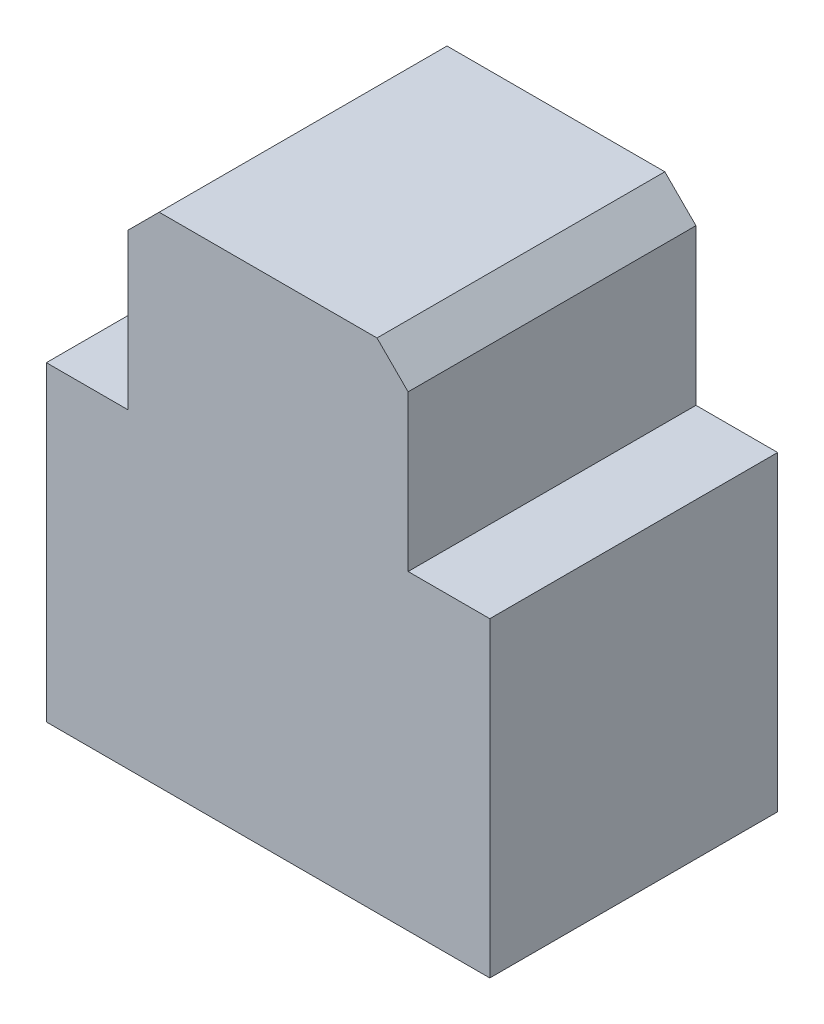
ISO-10303-21;
HEADER;
FILE_DESCRIPTION(('STEP AP214'),'2;1');
FILE_NAME('part.step','',(''),(''),'','','');
FILE_SCHEMA(('AUTOMOTIVE_DESIGN { 1 0 10303 214 1 1 1 1 }'));
ENDSEC;
DATA;
#1=APPLICATION_CONTEXT('core data for automotive mechanical design processes');
#2=APPLICATION_PROTOCOL_DEFINITION('international standard','automotive_design',2000,#1);
#3=PRODUCT_CONTEXT('',#1,'mechanical');
#4=PRODUCT('Part','Part','',(#3));
#5=PRODUCT_RELATED_PRODUCT_CATEGORY('part','',(#4));
#6=PRODUCT_DEFINITION_FORMATION('','',#4);
#7=PRODUCT_DEFINITION_CONTEXT('part definition',#1,'design');
#8=PRODUCT_DEFINITION('design','',#6,#7);
#9=PRODUCT_DEFINITION_SHAPE('','',#8);
#10=(LENGTH_UNIT() NAMED_UNIT(*) SI_UNIT(.MILLI.,.METRE.));
#11=(NAMED_UNIT(*) PLANE_ANGLE_UNIT() SI_UNIT($,.RADIAN.));
#12=(NAMED_UNIT(*) SI_UNIT($,.STERADIAN.) SOLID_ANGLE_UNIT());
#13=UNCERTAINTY_MEASURE_WITH_UNIT(LENGTH_MEASURE(1.E-05),#10,'distance_accuracy_value','');
#14=(GEOMETRIC_REPRESENTATION_CONTEXT(3) GLOBAL_UNCERTAINTY_ASSIGNED_CONTEXT((#13)) GLOBAL_UNIT_ASSIGNED_CONTEXT((#10,
#11,#12)) REPRESENTATION_CONTEXT('',''));
#15=CARTESIAN_POINT('',(0.,0.,0.));
#16=DIRECTION('',(0.,0.,1.));
#17=DIRECTION('',(1.,0.,0.));
#18=AXIS2_PLACEMENT_3D('',#15,#16,#17);
#19=CARTESIAN_POINT('',(2.85,0.,3.7));
#20=DIRECTION('',(1.,0.,0.));
#21=DIRECTION('',(0.,1.,0.));
#22=AXIS2_PLACEMENT_3D('',#19,#20,#21);
#23=PLANE('',#22);
#24=DIRECTION('',(0.,-1.,0.));
#25=VECTOR('',#24,1.);
#26=CARTESIAN_POINT('',(2.85,0.,0.));
#27=LINE('',#26,#25);
#28=CARTESIAN_POINT('',(2.85,2.,0.));
#29=VERTEX_POINT('',#28);
#30=CARTESIAN_POINT('',(2.85,-2.,0.));
#31=VERTEX_POINT('',#30);
#32=EDGE_CURVE('E133',#29,#31,#27,.T.);
#33=ORIENTED_EDGE('',*,*,#32,.F.);
#34=DIRECTION('',(0.,0.,-1.));
#35=VECTOR('',#34,1.);
#36=CARTESIAN_POINT('',(2.85,2.,3.7));
#37=LINE('',#36,#35);
#38=CARTESIAN_POINT('',(2.85,2.,3.7));
#39=VERTEX_POINT('',#38);
#40=EDGE_CURVE('E129',#39,#29,#37,.T.);
#41=ORIENTED_EDGE('',*,*,#40,.F.);
#42=DIRECTION('',(0.,-1.,0.));
#43=VECTOR('',#42,1.);
#44=CARTESIAN_POINT('',(2.85,0.,3.7));
#45=LINE('',#44,#43);
#46=CARTESIAN_POINT('',(2.85,-2.,3.7));
#47=VERTEX_POINT('',#46);
#48=EDGE_CURVE('E131',#39,#47,#45,.T.);
#49=ORIENTED_EDGE('',*,*,#48,.T.);
#50=DIRECTION('',(0.,0.,-1.));
#51=VECTOR('',#50,1.);
#52=CARTESIAN_POINT('',(2.85,-2.,3.7));
#53=LINE('',#52,#51);
#54=EDGE_CURVE('E179',#47,#31,#53,.T.);
#55=ORIENTED_EDGE('',*,*,#54,.T.);
#56=EDGE_LOOP('',(#33,#41,#49,#55));
#57=FACE_BOUND('',#56,.T.);
#58=ADVANCED_FACE('F49',(#57),#23,.T.);
#59=CARTESIAN_POINT('',(0.,2.,3.7));
#60=DIRECTION('',(0.,1.,0.));
#61=DIRECTION('',(0.,0.,1.));
#62=AXIS2_PLACEMENT_3D('',#59,#60,#61);
#63=PLANE('',#62);
#64=DIRECTION('',(1.,0.,0.));
#65=VECTOR('',#64,1.);
#66=CARTESIAN_POINT('',(0.,2.,0.));
#67=LINE('',#66,#65);
#68=CARTESIAN_POINT('',(1.8,2.,0.));
#69=VERTEX_POINT('',#68);
#70=EDGE_CURVE('E182',#69,#29,#67,.T.);
#71=ORIENTED_EDGE('',*,*,#70,.F.);
#72=DIRECTION('',(0.,0.,-1.));
#73=VECTOR('',#72,1.);
#74=CARTESIAN_POINT('',(1.8,2.,3.7));
#75=LINE('',#74,#73);
#76=CARTESIAN_POINT('',(1.8,2.,3.7));
#77=VERTEX_POINT('',#76);
#78=EDGE_CURVE('E140',#77,#69,#75,.T.);
#79=ORIENTED_EDGE('',*,*,#78,.F.);
#80=DIRECTION('',(1.,0.,0.));
#81=VECTOR('',#80,1.);
#82=CARTESIAN_POINT('',(0.,2.,3.7));
#83=LINE('',#82,#81);
#84=EDGE_CURVE('E144',#77,#39,#83,.T.);
#85=ORIENTED_EDGE('',*,*,#84,.T.);
#86=ORIENTED_EDGE('',*,*,#40,.T.);
#87=EDGE_LOOP('',(#71,#79,#85,#86));
#88=FACE_BOUND('',#87,.T.);
#89=ADVANCED_FACE('F151',(#88),#63,.T.);
#90=CARTESIAN_POINT('',(1.8,0.,3.7));
#91=DIRECTION('',(-1.,0.,0.));
#92=DIRECTION('',(0.,-1.,0.));
#93=AXIS2_PLACEMENT_3D('',#90,#91,#92);
#94=PLANE('',#93);
#95=DIRECTION('',(0.,1.,0.));
#96=VECTOR('',#95,1.);
#97=CARTESIAN_POINT('',(1.8,0.,0.));
#98=LINE('',#97,#96);
#99=CARTESIAN_POINT('',(1.8,4.,0.));
#100=VERTEX_POINT('',#99);
#101=EDGE_CURVE('E185',#69,#100,#98,.T.);
#102=ORIENTED_EDGE('',*,*,#101,.T.);
#103=DIRECTION('',(0.,0.,1.));
#104=VECTOR('',#103,1.);
#105=CARTESIAN_POINT('',(1.8,4.,3.7));
#106=LINE('',#105,#104);
#107=CARTESIAN_POINT('',(1.8,4.,3.7));
#108=VERTEX_POINT('',#107);
#109=EDGE_CURVE('E11',#100,#108,#106,.T.);
#110=ORIENTED_EDGE('',*,*,#109,.T.);
#111=DIRECTION('',(0.,1.,0.));
#112=VECTOR('',#111,1.);
#113=CARTESIAN_POINT('',(1.8,0.,3.7));
#114=LINE('',#113,#112);
#115=EDGE_CURVE('E153',#77,#108,#114,.T.);
#116=ORIENTED_EDGE('',*,*,#115,.F.);
#117=ORIENTED_EDGE('',*,*,#78,.T.);
#118=EDGE_LOOP('',(#102,#110,#116,#117));
#119=FACE_BOUND('',#118,.T.);
#120=ADVANCED_FACE('F256',(#119),#94,.F.);
#121=CARTESIAN_POINT('',(0.,4.4,3.7));
#122=DIRECTION('',(0.,1.,0.));
#123=DIRECTION('',(0.,0.,1.));
#124=AXIS2_PLACEMENT_3D('',#121,#122,#123);
#125=PLANE('',#124);
#126=DIRECTION('',(1.,0.,0.));
#127=VECTOR('',#126,1.);
#128=CARTESIAN_POINT('',(0.,4.4,0.));
#129=LINE('',#128,#127);
#130=CARTESIAN_POINT('',(-1.4,4.4,0.));
#131=VERTEX_POINT('',#130);
#132=CARTESIAN_POINT('',(1.4,4.4,0.));
#133=VERTEX_POINT('',#132);
#134=EDGE_CURVE('E189',#131,#133,#129,.T.);
#135=ORIENTED_EDGE('',*,*,#134,.F.);
#136=DIRECTION('',(0.,0.,1.));
#137=VECTOR('',#136,1.);
#138=CARTESIAN_POINT('',(-1.4,4.4,3.7));
#139=LINE('',#138,#137);
#140=CARTESIAN_POINT('',(-1.4,4.4,3.7));
#141=VERTEX_POINT('',#140);
#142=EDGE_CURVE('E229',#131,#141,#139,.T.);
#143=ORIENTED_EDGE('',*,*,#142,.T.);
#144=DIRECTION('',(1.,0.,0.));
#145=VECTOR('',#144,1.);
#146=CARTESIAN_POINT('',(0.,4.4,3.7));
#147=LINE('',#146,#145);
#148=CARTESIAN_POINT('',(1.4,4.4,3.7));
#149=VERTEX_POINT('',#148);
#150=EDGE_CURVE('E157',#141,#149,#147,.T.);
#151=ORIENTED_EDGE('',*,*,#150,.T.);
#152=DIRECTION('',(0.,0.,-1.));
#153=VECTOR('',#152,1.);
#154=CARTESIAN_POINT('',(1.4,4.4,0.));
#155=LINE('',#154,#153);
#156=EDGE_CURVE('E225',#149,#133,#155,.T.);
#157=ORIENTED_EDGE('',*,*,#156,.T.);
#158=EDGE_LOOP('',(#135,#143,#151,#157));
#159=FACE_BOUND('',#158,.T.);
#160=ADVANCED_FACE('F260',(#159),#125,.T.);
#161=CARTESIAN_POINT('',(-1.8,0.,3.7));
#162=DIRECTION('',(-1.,0.,0.));
#163=DIRECTION('',(0.,-1.,0.));
#164=AXIS2_PLACEMENT_3D('',#161,#162,#163);
#165=PLANE('',#164);
#166=DIRECTION('',(0.,1.,0.));
#167=VECTOR('',#166,1.);
#168=CARTESIAN_POINT('',(-1.8,0.,3.7));
#169=LINE('',#168,#167);
#170=CARTESIAN_POINT('',(-1.8,2.,3.7));
#171=VERTEX_POINT('',#170);
#172=CARTESIAN_POINT('',(-1.8,4.,3.7));
#173=VERTEX_POINT('',#172);
#174=EDGE_CURVE('E162',#171,#173,#169,.T.);
#175=ORIENTED_EDGE('',*,*,#174,.T.);
#176=DIRECTION('',(0.,0.,-1.));
#177=VECTOR('',#176,1.);
#178=CARTESIAN_POINT('',(-1.8,4.,3.7));
#179=LINE('',#178,#177);
#180=CARTESIAN_POINT('',(-1.8,4.,0.));
#181=VERTEX_POINT('',#180);
#182=EDGE_CURVE('E139',#173,#181,#179,.T.);
#183=ORIENTED_EDGE('',*,*,#182,.T.);
#184=DIRECTION('',(0.,1.,0.));
#185=VECTOR('',#184,1.);
#186=CARTESIAN_POINT('',(-1.8,0.,0.));
#187=LINE('',#186,#185);
#188=CARTESIAN_POINT('',(-1.8,2.,0.));
#189=VERTEX_POINT('',#188);
#190=EDGE_CURVE('E193',#189,#181,#187,.T.);
#191=ORIENTED_EDGE('',*,*,#190,.F.);
#192=DIRECTION('',(0.,0.,-1.));
#193=VECTOR('',#192,1.);
#194=CARTESIAN_POINT('',(-1.8,2.,3.7));
#195=LINE('',#194,#193);
#196=EDGE_CURVE('E212',#171,#189,#195,.T.);
#197=ORIENTED_EDGE('',*,*,#196,.F.);
#198=EDGE_LOOP('',(#175,#183,#191,#197));
#199=FACE_BOUND('',#198,.T.);
#200=ADVANCED_FACE('F239',(#199),#165,.T.);
#201=CARTESIAN_POINT('',(-2.85,2.,0.));
#202=VERTEX_POINT('',#201);
#203=EDGE_CURVE('E186',#202,#189,#67,.T.);
#204=ORIENTED_EDGE('',*,*,#203,.F.);
#205=DIRECTION('',(0.,0.,-1.));
#206=VECTOR('',#205,1.);
#207=CARTESIAN_POINT('',(-2.85,2.,3.7));
#208=LINE('',#207,#206);
#209=CARTESIAN_POINT('',(-2.85,2.,3.7));
#210=VERTEX_POINT('',#209);
#211=EDGE_CURVE('E209',#210,#202,#208,.T.);
#212=ORIENTED_EDGE('',*,*,#211,.F.);
#213=EDGE_CURVE('E155',#210,#171,#83,.T.);
#214=ORIENTED_EDGE('',*,*,#213,.T.);
#215=ORIENTED_EDGE('',*,*,#196,.T.);
#216=EDGE_LOOP('',(#204,#212,#214,#215));
#217=FACE_BOUND('',#216,.T.);
#218=ADVANCED_FACE('F248',(#217),#63,.T.);
#219=CARTESIAN_POINT('',(-2.85,0.,3.7));
#220=DIRECTION('',(1.,0.,0.));
#221=DIRECTION('',(0.,1.,0.));
#222=AXIS2_PLACEMENT_3D('',#219,#220,#221);
#223=PLANE('',#222);
#224=DIRECTION('',(0.,-1.,0.));
#225=VECTOR('',#224,1.);
#226=CARTESIAN_POINT('',(-2.85,0.,0.));
#227=LINE('',#226,#225);
#228=CARTESIAN_POINT('',(-2.85,-2.,0.));
#229=VERTEX_POINT('',#228);
#230=EDGE_CURVE('E197',#202,#229,#227,.T.);
#231=ORIENTED_EDGE('',*,*,#230,.T.);
#232=DIRECTION('',(0.,0.,-1.));
#233=VECTOR('',#232,1.);
#234=CARTESIAN_POINT('',(-2.85,-2.,3.7));
#235=LINE('',#234,#233);
#236=CARTESIAN_POINT('',(-2.85,-2.,3.7));
#237=VERTEX_POINT('',#236);
#238=EDGE_CURVE('E205',#237,#229,#235,.T.);
#239=ORIENTED_EDGE('',*,*,#238,.F.);
#240=DIRECTION('',(0.,-1.,0.));
#241=VECTOR('',#240,1.);
#242=CARTESIAN_POINT('',(-2.85,0.,3.7));
#243=LINE('',#242,#241);
#244=EDGE_CURVE('E161',#210,#237,#243,.T.);
#245=ORIENTED_EDGE('',*,*,#244,.F.);
#246=ORIENTED_EDGE('',*,*,#211,.T.);
#247=EDGE_LOOP('',(#231,#239,#245,#246));
#248=FACE_BOUND('',#247,.T.);
#249=ADVANCED_FACE('F252',(#248),#223,.F.);
#250=CARTESIAN_POINT('',(0.,-2.,3.7));
#251=DIRECTION('',(0.,1.,0.));
#252=DIRECTION('',(0.,0.,1.));
#253=AXIS2_PLACEMENT_3D('',#250,#251,#252);
#254=PLANE('',#253);
#255=DIRECTION('',(1.,0.,0.));
#256=VECTOR('',#255,1.);
#257=CARTESIAN_POINT('',(0.,-2.,0.));
#258=LINE('',#257,#256);
#259=EDGE_CURVE('E149',#229,#31,#258,.T.);
#260=ORIENTED_EDGE('',*,*,#259,.T.);
#261=ORIENTED_EDGE('',*,*,#54,.F.);
#262=DIRECTION('',(1.,0.,0.));
#263=VECTOR('',#262,1.);
#264=CARTESIAN_POINT('',(0.,-2.,3.7));
#265=LINE('',#264,#263);
#266=EDGE_CURVE('E146',#237,#47,#265,.T.);
#267=ORIENTED_EDGE('',*,*,#266,.F.);
#268=ORIENTED_EDGE('',*,*,#238,.T.);
#269=EDGE_LOOP('',(#260,#261,#267,#268));
#270=FACE_BOUND('',#269,.T.);
#271=ADVANCED_FACE('F254',(#270),#254,.F.);
#272=CARTESIAN_POINT('',(0.,0.,3.7));
#273=DIRECTION('',(0.,0.,1.));
#274=DIRECTION('',(1.,0.,0.));
#275=AXIS2_PLACEMENT_3D('',#272,#273,#274);
#276=PLANE('',#275);
#277=ORIENTED_EDGE('',*,*,#150,.F.);
#278=DIRECTION('',(0.70710678118655,0.707106781186545,0.));
#279=VECTOR('',#278,1.);
#280=CARTESIAN_POINT('',(-2.89999999999999,2.90000000000001,3.7));
#281=LINE('',#280,#279);
#282=EDGE_CURVE('E59',#141,#173,#281,.F.);
#283=ORIENTED_EDGE('',*,*,#282,.T.);
#284=ORIENTED_EDGE('',*,*,#174,.F.);
#285=ORIENTED_EDGE('',*,*,#213,.F.);
#286=ORIENTED_EDGE('',*,*,#244,.T.);
#287=ORIENTED_EDGE('',*,*,#266,.T.);
#288=ORIENTED_EDGE('',*,*,#48,.F.);
#289=ORIENTED_EDGE('',*,*,#84,.F.);
#290=ORIENTED_EDGE('',*,*,#115,.T.);
#291=DIRECTION('',(-0.707106781186545,0.70710678118655,0.));
#292=VECTOR('',#291,1.);
#293=CARTESIAN_POINT('',(2.90000000000001,2.89999999999999,3.7));
#294=LINE('',#293,#292);
#295=EDGE_CURVE('E71',#108,#149,#294,.T.);
#296=ORIENTED_EDGE('',*,*,#295,.T.);
#297=EDGE_LOOP('',(#277,#283,#284,#285,#286,#287,#288,#289,#290,#296));
#298=FACE_BOUND('',#297,.T.);
#299=ADVANCED_FACE('F143',(#298),#276,.T.);
#300=CARTESIAN_POINT('',(0.,0.,0.));
#301=DIRECTION('',(0.,0.,1.));
#302=DIRECTION('',(1.,0.,0.));
#303=AXIS2_PLACEMENT_3D('',#300,#301,#302);
#304=PLANE('',#303);
#305=ORIENTED_EDGE('',*,*,#190,.T.);
#306=DIRECTION('',(-0.70710678118655,-0.707106781186545,0.));
#307=VECTOR('',#306,1.);
#308=CARTESIAN_POINT('',(-1.8,4.,0.));
#309=LINE('',#308,#307);
#310=EDGE_CURVE('E222',#181,#131,#309,.F.);
#311=ORIENTED_EDGE('',*,*,#310,.T.);
#312=ORIENTED_EDGE('',*,*,#134,.T.);
#313=DIRECTION('',(0.707106781186545,-0.70710678118655,0.));
#314=VECTOR('',#313,1.);
#315=CARTESIAN_POINT('',(1.4,4.4,0.));
#316=LINE('',#315,#314);
#317=EDGE_CURVE('E219',#133,#100,#316,.T.);
#318=ORIENTED_EDGE('',*,*,#317,.T.);
#319=ORIENTED_EDGE('',*,*,#101,.F.);
#320=ORIENTED_EDGE('',*,*,#70,.T.);
#321=ORIENTED_EDGE('',*,*,#32,.T.);
#322=ORIENTED_EDGE('',*,*,#259,.F.);
#323=ORIENTED_EDGE('',*,*,#230,.F.);
#324=ORIENTED_EDGE('',*,*,#203,.T.);
#325=EDGE_LOOP('',(#305,#311,#312,#318,#319,#320,#321,#322,#323,#324));
#326=FACE_BOUND('',#325,.T.);
#327=ADVANCED_FACE('F242',(#326),#304,.F.);
#328=CARTESIAN_POINT('',(-1.8,4.,3.7));
#329=DIRECTION('',(0.707106781186545,-0.70710678118655,0.));
#330=DIRECTION('',(0.,0.,-1.));
#331=AXIS2_PLACEMENT_3D('',#328,#329,#330);
#332=PLANE('',#331);
#333=ORIENTED_EDGE('',*,*,#282,.F.);
#334=ORIENTED_EDGE('',*,*,#142,.F.);
#335=ORIENTED_EDGE('',*,*,#310,.F.);
#336=ORIENTED_EDGE('',*,*,#182,.F.);
#337=EDGE_LOOP('',(#333,#334,#335,#336));
#338=FACE_BOUND('',#337,.T.);
#339=ADVANCED_FACE('F237',(#338),#332,.F.);
#340=CARTESIAN_POINT('',(1.4,4.4,3.7));
#341=DIRECTION('',(0.70710678118655,0.707106781186545,0.));
#342=DIRECTION('',(0.,0.,1.));
#343=AXIS2_PLACEMENT_3D('',#340,#341,#342);
#344=PLANE('',#343);
#345=ORIENTED_EDGE('',*,*,#295,.F.);
#346=ORIENTED_EDGE('',*,*,#109,.F.);
#347=ORIENTED_EDGE('',*,*,#317,.F.);
#348=ORIENTED_EDGE('',*,*,#156,.F.);
#349=EDGE_LOOP('',(#345,#346,#347,#348));
#350=FACE_BOUND('',#349,.T.);
#351=ADVANCED_FACE('F52',(#350),#344,.T.);
#352=CLOSED_SHELL('',(#58,#89,#120,#160,#200,#218,#249,#271,#299,#327,#339,#351));
#353=MANIFOLD_SOLID_BREP('B2',#352);
#354=ADVANCED_BREP_SHAPE_REPRESENTATION('',(#18,#353),#14);
#355=SHAPE_DEFINITION_REPRESENTATION(#9,#354);
ENDSEC;
END-ISO-10303-21;
